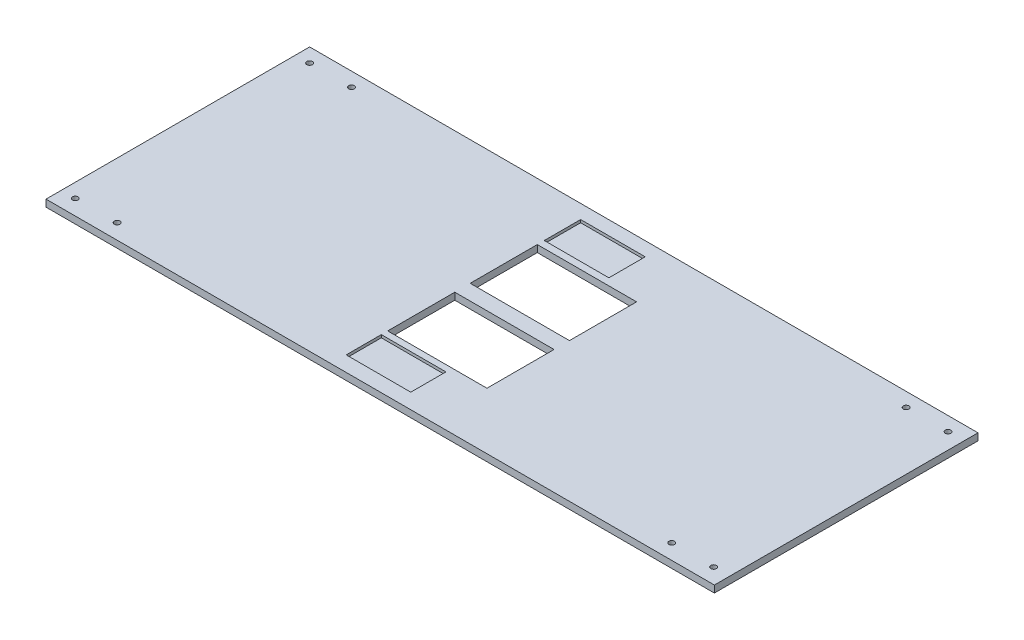
ISO-10303-21;
HEADER;
FILE_DESCRIPTION(('STEP AP214'),'2;1');
FILE_NAME('part.step','',(''),(''),'','','');
FILE_SCHEMA(('AUTOMOTIVE_DESIGN { 1 0 10303 214 1 1 1 1 }'));
ENDSEC;
DATA;
#1=APPLICATION_CONTEXT('core data for automotive mechanical design processes');
#2=APPLICATION_PROTOCOL_DEFINITION('international standard','automotive_design',2000,#1);
#3=PRODUCT_CONTEXT('',#1,'mechanical');
#4=PRODUCT('Part','Part','',(#3));
#5=PRODUCT_RELATED_PRODUCT_CATEGORY('part','',(#4));
#6=PRODUCT_DEFINITION_FORMATION('','',#4);
#7=PRODUCT_DEFINITION_CONTEXT('part definition',#1,'design');
#8=PRODUCT_DEFINITION('design','',#6,#7);
#9=PRODUCT_DEFINITION_SHAPE('','',#8);
#10=(LENGTH_UNIT() NAMED_UNIT(*) SI_UNIT(.MILLI.,.METRE.));
#11=(NAMED_UNIT(*) PLANE_ANGLE_UNIT() SI_UNIT($,.RADIAN.));
#12=(NAMED_UNIT(*) SI_UNIT($,.STERADIAN.) SOLID_ANGLE_UNIT());
#13=UNCERTAINTY_MEASURE_WITH_UNIT(LENGTH_MEASURE(1.E-05),#10,'distance_accuracy_value','');
#14=(GEOMETRIC_REPRESENTATION_CONTEXT(3) GLOBAL_UNCERTAINTY_ASSIGNED_CONTEXT((#13)) GLOBAL_UNIT_ASSIGNED_CONTEXT((#10,
#11,#12)) REPRESENTATION_CONTEXT('',''));
#15=CARTESIAN_POINT('',(0.,0.,0.));
#16=DIRECTION('',(0.,0.,1.));
#17=DIRECTION('',(1.,0.,0.));
#18=AXIS2_PLACEMENT_3D('',#15,#16,#17);
#19=CARTESIAN_POINT('',(164.635056760077,5.,0.));
#20=DIRECTION('',(1.,0.,0.));
#21=DIRECTION('',(0.,0.,-1.));
#22=AXIS2_PLACEMENT_3D('',#19,#20,#21);
#23=PLANE('',#22);
#24=DIRECTION('',(0.,-1.,0.));
#25=VECTOR('',#24,1.);
#26=CARTESIAN_POINT('',(164.635056760077,5.,-127.861939650777));
#27=LINE('',#26,#25);
#28=CARTESIAN_POINT('',(164.635056760077,5.,-127.861939650777));
#29=VERTEX_POINT('',#28);
#30=CARTESIAN_POINT('',(164.635056760077,3.,-127.861939650777));
#31=VERTEX_POINT('',#30);
#32=EDGE_CURVE('E191',#29,#31,#27,.T.);
#33=ORIENTED_EDGE('',*,*,#32,.T.);
#34=DIRECTION('',(0.,0.,1.));
#35=VECTOR('',#34,1.);
#36=CARTESIAN_POINT('',(164.635056760077,3.,-127.861939650777));
#37=LINE('',#36,#35);
#38=CARTESIAN_POINT('',(164.635056760077,3.,-101.861939650777));
#39=VERTEX_POINT('',#38);
#40=EDGE_CURVE('E51',#31,#39,#37,.T.);
#41=ORIENTED_EDGE('',*,*,#40,.T.);
#42=DIRECTION('',(0.,-1.,0.));
#43=VECTOR('',#42,1.);
#44=CARTESIAN_POINT('',(164.635056760077,5.,-101.861939650777));
#45=LINE('',#44,#43);
#46=CARTESIAN_POINT('',(164.635056760077,5.,-101.861939650777));
#47=VERTEX_POINT('',#46);
#48=EDGE_CURVE('E11',#47,#39,#45,.T.);
#49=ORIENTED_EDGE('',*,*,#48,.F.);
#50=DIRECTION('',(0.,0.,1.));
#51=VECTOR('',#50,1.);
#52=CARTESIAN_POINT('',(164.635056760077,5.,0.));
#53=LINE('',#52,#51);
#54=EDGE_CURVE('E327',#29,#47,#53,.T.);
#55=ORIENTED_EDGE('',*,*,#54,.F.);
#56=EDGE_LOOP('',(#33,#41,#49,#55));
#57=FACE_BOUND('',#56,.T.);
#58=ADVANCED_FACE('F34',(#57),#23,.F.);
#59=CARTESIAN_POINT('',(0.,5.,-101.861939650777));
#60=DIRECTION('',(0.,0.,1.));
#61=DIRECTION('',(1.,0.,0.));
#62=AXIS2_PLACEMENT_3D('',#59,#60,#61);
#63=PLANE('',#62);
#64=ORIENTED_EDGE('',*,*,#48,.T.);
#65=DIRECTION('',(-1.,0.,0.));
#66=VECTOR('',#65,1.);
#67=CARTESIAN_POINT('',(118.435056760077,3.,-101.861939650777));
#68=LINE('',#67,#66);
#69=CARTESIAN_POINT('',(118.435056760077,3.,-101.861939650777));
#70=VERTEX_POINT('',#69);
#71=EDGE_CURVE('E428',#39,#70,#68,.T.);
#72=ORIENTED_EDGE('',*,*,#71,.T.);
#73=DIRECTION('',(0.,-1.,0.));
#74=VECTOR('',#73,1.);
#75=CARTESIAN_POINT('',(118.435056760077,5.,-101.861939650777));
#76=LINE('',#75,#74);
#77=CARTESIAN_POINT('',(118.435056760077,5.,-101.861939650777));
#78=VERTEX_POINT('',#77);
#79=EDGE_CURVE('E43',#78,#70,#76,.T.);
#80=ORIENTED_EDGE('',*,*,#79,.F.);
#81=DIRECTION('',(-1.,0.,0.));
#82=VECTOR('',#81,1.);
#83=CARTESIAN_POINT('',(0.,5.,-101.861939650777));
#84=LINE('',#83,#82);
#85=EDGE_CURVE('E359',#47,#78,#84,.T.);
#86=ORIENTED_EDGE('',*,*,#85,.F.);
#87=EDGE_LOOP('',(#64,#72,#80,#86));
#88=FACE_BOUND('',#87,.T.);
#89=ADVANCED_FACE('F393',(#88),#63,.F.);
#90=CARTESIAN_POINT('',(118.435056760077,5.,0.));
#91=DIRECTION('',(1.,0.,0.));
#92=DIRECTION('',(0.,0.,-1.));
#93=AXIS2_PLACEMENT_3D('',#90,#91,#92);
#94=PLANE('',#93);
#95=DIRECTION('',(0.,0.,-1.));
#96=VECTOR('',#95,1.);
#97=CARTESIAN_POINT('',(118.435056760077,3.,-127.861939650777));
#98=LINE('',#97,#96);
#99=CARTESIAN_POINT('',(118.435056760077,3.,-127.861939650777));
#100=VERTEX_POINT('',#99);
#101=EDGE_CURVE('E173',#70,#100,#98,.T.);
#102=ORIENTED_EDGE('',*,*,#101,.T.);
#103=DIRECTION('',(0.,-1.,0.));
#104=VECTOR('',#103,1.);
#105=CARTESIAN_POINT('',(118.435056760077,5.,-127.861939650777));
#106=LINE('',#105,#104);
#107=CARTESIAN_POINT('',(118.435056760077,5.,-127.861939650777));
#108=VERTEX_POINT('',#107);
#109=EDGE_CURVE('E184',#108,#100,#106,.T.);
#110=ORIENTED_EDGE('',*,*,#109,.F.);
#111=DIRECTION('',(0.,0.,1.));
#112=VECTOR('',#111,1.);
#113=CARTESIAN_POINT('',(118.435056760077,5.,0.));
#114=LINE('',#113,#112);
#115=EDGE_CURVE('E334',#108,#78,#114,.T.);
#116=ORIENTED_EDGE('',*,*,#115,.T.);
#117=ORIENTED_EDGE('',*,*,#79,.T.);
#118=EDGE_LOOP('',(#102,#110,#116,#117));
#119=FACE_BOUND('',#118,.T.);
#120=ADVANCED_FACE('F182',(#119),#94,.T.);
#121=CARTESIAN_POINT('',(0.,5.,-96.8619396507771));
#122=DIRECTION('',(0.,0.,-1.));
#123=DIRECTION('',(-1.,0.,0.));
#124=AXIS2_PLACEMENT_3D('',#121,#122,#123);
#125=PLANE('',#124);
#126=DIRECTION('',(1.,0.,0.));
#127=VECTOR('',#126,1.);
#128=CARTESIAN_POINT('',(0.,0.,-96.8619396507771));
#129=LINE('',#128,#127);
#130=CARTESIAN_POINT('',(118.435056760077,0.,-96.8619396507771));
#131=VERTEX_POINT('',#130);
#132=CARTESIAN_POINT('',(189.435056760077,0.,-96.8619396507771));
#133=VERTEX_POINT('',#132);
#134=EDGE_CURVE('E288',#131,#133,#129,.T.);
#135=ORIENTED_EDGE('',*,*,#134,.T.);
#136=DIRECTION('',(0.,-1.,0.));
#137=VECTOR('',#136,1.);
#138=CARTESIAN_POINT('',(189.435056760077,5.,-96.8619396507771));
#139=LINE('',#138,#137);
#140=CARTESIAN_POINT('',(189.435056760077,5.,-96.8619396507771));
#141=VERTEX_POINT('',#140);
#142=EDGE_CURVE('E194',#141,#133,#139,.T.);
#143=ORIENTED_EDGE('',*,*,#142,.F.);
#144=DIRECTION('',(1.,0.,0.));
#145=VECTOR('',#144,1.);
#146=CARTESIAN_POINT('',(0.,5.,-96.8619396507771));
#147=LINE('',#146,#145);
#148=CARTESIAN_POINT('',(118.435056760077,5.,-96.8619396507771));
#149=VERTEX_POINT('',#148);
#150=EDGE_CURVE('E350',#149,#141,#147,.T.);
#151=ORIENTED_EDGE('',*,*,#150,.F.);
#152=DIRECTION('',(0.,-1.,0.));
#153=VECTOR('',#152,1.);
#154=CARTESIAN_POINT('',(118.435056760077,5.,-96.8619396507771));
#155=LINE('',#154,#153);
#156=EDGE_CURVE('E198',#149,#131,#155,.T.);
#157=ORIENTED_EDGE('',*,*,#156,.T.);
#158=EDGE_LOOP('',(#135,#143,#151,#157));
#159=FACE_BOUND('',#158,.T.);
#160=ADVANCED_FACE('F505',(#159),#125,.F.);
#161=CARTESIAN_POINT('',(189.435056760077,5.,0.));
#162=DIRECTION('',(1.,0.,0.));
#163=DIRECTION('',(0.,0.,-1.));
#164=AXIS2_PLACEMENT_3D('',#161,#162,#163);
#165=PLANE('',#164);
#166=DIRECTION('',(0.,0.,1.));
#167=VECTOR('',#166,1.);
#168=CARTESIAN_POINT('',(189.435056760077,0.,0.));
#169=LINE('',#168,#167);
#170=CARTESIAN_POINT('',(189.435056760077,0.,-48.8619396507771));
#171=VERTEX_POINT('',#170);
#172=EDGE_CURVE('E291',#133,#171,#169,.T.);
#173=ORIENTED_EDGE('',*,*,#172,.T.);
#174=DIRECTION('',(0.,-1.,0.));
#175=VECTOR('',#174,1.);
#176=CARTESIAN_POINT('',(189.435056760077,5.,-48.8619396507771));
#177=LINE('',#176,#175);
#178=CARTESIAN_POINT('',(189.435056760077,5.,-48.8619396507771));
#179=VERTEX_POINT('',#178);
#180=EDGE_CURVE('E203',#179,#171,#177,.T.);
#181=ORIENTED_EDGE('',*,*,#180,.F.);
#182=DIRECTION('',(0.,0.,1.));
#183=VECTOR('',#182,1.);
#184=CARTESIAN_POINT('',(189.435056760077,5.,0.));
#185=LINE('',#184,#183);
#186=EDGE_CURVE('E353',#141,#179,#185,.T.);
#187=ORIENTED_EDGE('',*,*,#186,.F.);
#188=ORIENTED_EDGE('',*,*,#142,.T.);
#189=EDGE_LOOP('',(#173,#181,#187,#188));
#190=FACE_BOUND('',#189,.T.);
#191=ADVANCED_FACE('F509',(#190),#165,.F.);
#192=CARTESIAN_POINT('',(0.,5.,-48.8619396507771));
#193=DIRECTION('',(0.,0.,-1.));
#194=DIRECTION('',(-1.,0.,0.));
#195=AXIS2_PLACEMENT_3D('',#192,#193,#194);
#196=PLANE('',#195);
#197=DIRECTION('',(1.,0.,0.));
#198=VECTOR('',#197,1.);
#199=CARTESIAN_POINT('',(0.,0.,-48.8619396507771));
#200=LINE('',#199,#198);
#201=CARTESIAN_POINT('',(118.435056760077,0.,-48.8619396507771));
#202=VERTEX_POINT('',#201);
#203=EDGE_CURVE('E272',#202,#171,#200,.T.);
#204=ORIENTED_EDGE('',*,*,#203,.F.);
#205=DIRECTION('',(0.,-1.,0.));
#206=VECTOR('',#205,1.);
#207=CARTESIAN_POINT('',(118.435056760077,5.,-48.8619396507771));
#208=LINE('',#207,#206);
#209=CARTESIAN_POINT('',(118.435056760077,5.,-48.8619396507771));
#210=VERTEX_POINT('',#209);
#211=EDGE_CURVE('E200',#210,#202,#208,.T.);
#212=ORIENTED_EDGE('',*,*,#211,.F.);
#213=DIRECTION('',(1.,0.,0.));
#214=VECTOR('',#213,1.);
#215=CARTESIAN_POINT('',(0.,5.,-48.8619396507771));
#216=LINE('',#215,#214);
#217=EDGE_CURVE('E355',#210,#179,#216,.T.);
#218=ORIENTED_EDGE('',*,*,#217,.T.);
#219=ORIENTED_EDGE('',*,*,#180,.T.);
#220=EDGE_LOOP('',(#204,#212,#218,#219));
#221=FACE_BOUND('',#220,.T.);
#222=ADVANCED_FACE('F466',(#221),#196,.T.);
#223=CARTESIAN_POINT('',(0.,5.,-37.8392674178881));
#224=DIRECTION('',(0.,0.,-1.));
#225=DIRECTION('',(-1.,0.,0.));
#226=AXIS2_PLACEMENT_3D('',#223,#224,#225);
#227=PLANE('',#226);
#228=DIRECTION('',(1.,0.,0.));
#229=VECTOR('',#228,1.);
#230=CARTESIAN_POINT('',(0.,0.,-37.8392674178881));
#231=LINE('',#230,#229);
#232=CARTESIAN_POINT('',(118.435056760077,0.,-37.8392674178881));
#233=VERTEX_POINT('',#232);
#234=CARTESIAN_POINT('',(189.435056760077,0.,-37.8392674178881));
#235=VERTEX_POINT('',#234);
#236=EDGE_CURVE('E279',#233,#235,#231,.T.);
#237=ORIENTED_EDGE('',*,*,#236,.T.);
#238=DIRECTION('',(0.,-1.,0.));
#239=VECTOR('',#238,1.);
#240=CARTESIAN_POINT('',(189.435056760077,5.,-37.8392674178881));
#241=LINE('',#240,#239);
#242=CARTESIAN_POINT('',(189.435056760077,5.,-37.8392674178881));
#243=VERTEX_POINT('',#242);
#244=EDGE_CURVE('E201',#243,#235,#241,.T.);
#245=ORIENTED_EDGE('',*,*,#244,.F.);
#246=DIRECTION('',(1.,0.,0.));
#247=VECTOR('',#246,1.);
#248=CARTESIAN_POINT('',(0.,5.,-37.8392674178881));
#249=LINE('',#248,#247);
#250=CARTESIAN_POINT('',(118.435056760077,5.,-37.8392674178881));
#251=VERTEX_POINT('',#250);
#252=EDGE_CURVE('E343',#251,#243,#249,.T.);
#253=ORIENTED_EDGE('',*,*,#252,.F.);
#254=DIRECTION('',(0.,-1.,0.));
#255=VECTOR('',#254,1.);
#256=CARTESIAN_POINT('',(118.435056760077,5.,-37.8392674178881));
#257=LINE('',#256,#255);
#258=EDGE_CURVE('E207',#251,#233,#257,.T.);
#259=ORIENTED_EDGE('',*,*,#258,.T.);
#260=EDGE_LOOP('',(#237,#245,#253,#259));
#261=FACE_BOUND('',#260,.T.);
#262=ADVANCED_FACE('F459',(#261),#227,.F.);
#263=CARTESIAN_POINT('',(189.435056760077,5.,-1.09539146711568E-13));
#264=DIRECTION('',(-1.,0.,0.));
#265=DIRECTION('',(0.,0.,1.));
#266=AXIS2_PLACEMENT_3D('',#263,#264,#265);
#267=PLANE('',#266);
#268=DIRECTION('',(0.,0.,-1.));
#269=VECTOR('',#268,1.);
#270=CARTESIAN_POINT('',(189.435056760077,0.,-1.09539146711568E-13));
#271=LINE('',#270,#269);
#272=CARTESIAN_POINT('',(189.435056760077,0.,10.1607325821119));
#273=VERTEX_POINT('',#272);
#274=EDGE_CURVE('E282',#273,#235,#271,.T.);
#275=ORIENTED_EDGE('',*,*,#274,.F.);
#276=DIRECTION('',(0.,-1.,0.));
#277=VECTOR('',#276,1.);
#278=CARTESIAN_POINT('',(189.435056760077,5.,10.1607325821119));
#279=LINE('',#278,#277);
#280=CARTESIAN_POINT('',(189.435056760077,5.,10.1607325821119));
#281=VERTEX_POINT('',#280);
#282=EDGE_CURVE('E212',#281,#273,#279,.T.);
#283=ORIENTED_EDGE('',*,*,#282,.F.);
#284=DIRECTION('',(0.,0.,-1.));
#285=VECTOR('',#284,1.);
#286=CARTESIAN_POINT('',(189.435056760077,5.,-1.09539146711568E-13));
#287=LINE('',#286,#285);
#288=EDGE_CURVE('E345',#281,#243,#287,.T.);
#289=ORIENTED_EDGE('',*,*,#288,.T.);
#290=ORIENTED_EDGE('',*,*,#244,.T.);
#291=EDGE_LOOP('',(#275,#283,#289,#290));
#292=FACE_BOUND('',#291,.T.);
#293=ADVANCED_FACE('F414',(#292),#267,.T.);
#294=CARTESIAN_POINT('',(0.,5.,10.1607325821119));
#295=DIRECTION('',(0.,0.,1.));
#296=DIRECTION('',(1.,0.,0.));
#297=AXIS2_PLACEMENT_3D('',#294,#295,#296);
#298=PLANE('',#297);
#299=DIRECTION('',(-1.,0.,0.));
#300=VECTOR('',#299,1.);
#301=CARTESIAN_POINT('',(0.,0.,10.1607325821119));
#302=LINE('',#301,#300);
#303=CARTESIAN_POINT('',(118.435056760077,0.,10.1607325821119));
#304=VERTEX_POINT('',#303);
#305=EDGE_CURVE('E285',#273,#304,#302,.T.);
#306=ORIENTED_EDGE('',*,*,#305,.T.);
#307=DIRECTION('',(0.,-1.,0.));
#308=VECTOR('',#307,1.);
#309=CARTESIAN_POINT('',(118.435056760077,5.,10.1607325821119));
#310=LINE('',#309,#308);
#311=CARTESIAN_POINT('',(118.435056760077,5.,10.1607325821119));
#312=VERTEX_POINT('',#311);
#313=EDGE_CURVE('E209',#312,#304,#310,.T.);
#314=ORIENTED_EDGE('',*,*,#313,.F.);
#315=DIRECTION('',(-1.,0.,0.));
#316=VECTOR('',#315,1.);
#317=CARTESIAN_POINT('',(0.,5.,10.1607325821119));
#318=LINE('',#317,#316);
#319=EDGE_CURVE('E348',#281,#312,#318,.T.);
#320=ORIENTED_EDGE('',*,*,#319,.F.);
#321=ORIENTED_EDGE('',*,*,#282,.T.);
#322=EDGE_LOOP('',(#306,#314,#320,#321));
#323=FACE_BOUND('',#322,.T.);
#324=ADVANCED_FACE('F405',(#323),#298,.F.);
#325=DIRECTION('',(0.,-1.,0.));
#326=VECTOR('',#325,1.);
#327=CARTESIAN_POINT('',(164.635056760077,5.,14.7280603492229));
#328=LINE('',#327,#326);
#329=CARTESIAN_POINT('',(164.635056760077,5.,14.7280603492229));
#330=VERTEX_POINT('',#329);
#331=CARTESIAN_POINT('',(164.635056760077,3.,14.7280603492229));
#332=VERTEX_POINT('',#331);
#333=EDGE_CURVE('E215',#330,#332,#328,.T.);
#334=ORIENTED_EDGE('',*,*,#333,.T.);
#335=DIRECTION('',(0.,0.,1.));
#336=VECTOR('',#335,1.);
#337=CARTESIAN_POINT('',(164.635056760077,3.,14.7280603492229));
#338=LINE('',#337,#336);
#339=CARTESIAN_POINT('',(164.635056760077,3.,39.8415615787334));
#340=VERTEX_POINT('',#339);
#341=EDGE_CURVE('E59',#332,#340,#338,.T.);
#342=ORIENTED_EDGE('',*,*,#341,.T.);
#343=DIRECTION('',(0.,-1.,0.));
#344=VECTOR('',#343,1.);
#345=CARTESIAN_POINT('',(164.635056760077,5.,39.8415615787334));
#346=LINE('',#345,#344);
#347=CARTESIAN_POINT('',(164.635056760077,5.,39.8415615787334));
#348=VERTEX_POINT('',#347);
#349=EDGE_CURVE('E210',#348,#340,#346,.T.);
#350=ORIENTED_EDGE('',*,*,#349,.F.);
#351=EDGE_CURVE('E324',#330,#348,#53,.T.);
#352=ORIENTED_EDGE('',*,*,#351,.F.);
#353=EDGE_LOOP('',(#334,#342,#350,#352));
#354=FACE_BOUND('',#353,.T.);
#355=ADVANCED_FACE('F396',(#354),#23,.F.);
#356=CARTESIAN_POINT('',(0.,5.,39.8415615787334));
#357=DIRECTION('',(0.,0.,-1.));
#358=DIRECTION('',(-1.,0.,0.));
#359=AXIS2_PLACEMENT_3D('',#356,#357,#358);
#360=PLANE('',#359);
#361=DIRECTION('',(-1.,0.,0.));
#362=VECTOR('',#361,1.);
#363=CARTESIAN_POINT('',(118.435056760077,3.,39.8415615787334));
#364=LINE('',#363,#362);
#365=CARTESIAN_POINT('',(118.435056760077,3.,39.8415615787334));
#366=VERTEX_POINT('',#365);
#367=EDGE_CURVE('E253',#340,#366,#364,.T.);
#368=ORIENTED_EDGE('',*,*,#367,.T.);
#369=DIRECTION('',(0.,-1.,0.));
#370=VECTOR('',#369,1.);
#371=CARTESIAN_POINT('',(118.435056760077,5.,39.8415615787334));
#372=LINE('',#371,#370);
#373=CARTESIAN_POINT('',(118.435056760077,5.,39.8415615787334));
#374=VERTEX_POINT('',#373);
#375=EDGE_CURVE('E221',#374,#366,#372,.T.);
#376=ORIENTED_EDGE('',*,*,#375,.F.);
#377=DIRECTION('',(1.,0.,0.));
#378=VECTOR('',#377,1.);
#379=CARTESIAN_POINT('',(0.,5.,39.8415615787334));
#380=LINE('',#379,#378);
#381=EDGE_CURVE('E326',#374,#348,#380,.T.);
#382=ORIENTED_EDGE('',*,*,#381,.T.);
#383=ORIENTED_EDGE('',*,*,#349,.T.);
#384=EDGE_LOOP('',(#368,#376,#382,#383));
#385=FACE_BOUND('',#384,.T.);
#386=ADVANCED_FACE('F404',(#385),#360,.T.);
#387=DIRECTION('',(0.,0.,-1.));
#388=VECTOR('',#387,1.);
#389=CARTESIAN_POINT('',(118.435056760077,3.,14.7280603492229));
#390=LINE('',#389,#388);
#391=CARTESIAN_POINT('',(118.435056760077,3.,14.7280603492229));
#392=VERTEX_POINT('',#391);
#393=EDGE_CURVE('E426',#366,#392,#390,.T.);
#394=ORIENTED_EDGE('',*,*,#393,.T.);
#395=DIRECTION('',(0.,-1.,0.));
#396=VECTOR('',#395,1.);
#397=CARTESIAN_POINT('',(118.435056760077,5.,14.7280603492229));
#398=LINE('',#397,#396);
#399=CARTESIAN_POINT('',(118.435056760077,5.,14.7280603492229));
#400=VERTEX_POINT('',#399);
#401=EDGE_CURVE('E218',#400,#392,#398,.T.);
#402=ORIENTED_EDGE('',*,*,#401,.F.);
#403=EDGE_CURVE('E330',#400,#374,#114,.T.);
#404=ORIENTED_EDGE('',*,*,#403,.T.);
#405=ORIENTED_EDGE('',*,*,#375,.T.);
#406=EDGE_LOOP('',(#394,#402,#404,#405));
#407=FACE_BOUND('',#406,.T.);
#408=ADVANCED_FACE('F411',(#407),#94,.T.);
#409=CARTESIAN_POINT('',(0.,5.,50.7280603492229));
#410=DIRECTION('',(0.,0.,-1.));
#411=DIRECTION('',(-1.,0.,0.));
#412=AXIS2_PLACEMENT_3D('',#409,#410,#411);
#413=PLANE('',#412);
#414=DIRECTION('',(1.,0.,0.));
#415=VECTOR('',#414,1.);
#416=CARTESIAN_POINT('',(0.,0.,50.7280603492229));
#417=LINE('',#416,#415);
#418=CARTESIAN_POINT('',(-85.4449432399227,0.,50.7280603492229));
#419=VERTEX_POINT('',#418);
#420=CARTESIAN_POINT('',(392.705056760077,0.,50.7280603492229));
#421=VERTEX_POINT('',#420);
#422=EDGE_CURVE('E249',#419,#421,#417,.T.);
#423=ORIENTED_EDGE('',*,*,#422,.T.);
#424=DIRECTION('',(0.,-1.,0.));
#425=VECTOR('',#424,1.);
#426=CARTESIAN_POINT('',(392.705056760077,5.,50.7280603492229));
#427=LINE('',#426,#425);
#428=CARTESIAN_POINT('',(392.705056760077,5.,50.7280603492229));
#429=VERTEX_POINT('',#428);
#430=EDGE_CURVE('E38',#429,#421,#427,.T.);
#431=ORIENTED_EDGE('',*,*,#430,.F.);
#432=DIRECTION('',(1.,0.,0.));
#433=VECTOR('',#432,1.);
#434=CARTESIAN_POINT('',(0.,5.,50.7280603492229));
#435=LINE('',#434,#433);
#436=CARTESIAN_POINT('',(-85.4449432399227,5.,50.7280603492229));
#437=VERTEX_POINT('',#436);
#438=EDGE_CURVE('E308',#437,#429,#435,.T.);
#439=ORIENTED_EDGE('',*,*,#438,.F.);
#440=DIRECTION('',(0.,-1.,0.));
#441=VECTOR('',#440,1.);
#442=CARTESIAN_POINT('',(-85.4449432399227,5.,50.7280603492229));
#443=LINE('',#442,#441);
#444=EDGE_CURVE('E226',#437,#419,#443,.T.);
#445=ORIENTED_EDGE('',*,*,#444,.T.);
#446=EDGE_LOOP('',(#423,#431,#439,#445));
#447=FACE_BOUND('',#446,.T.);
#448=ADVANCED_FACE('F36',(#447),#413,.F.);
#449=CARTESIAN_POINT('',(392.705056760077,5.,0.));
#450=DIRECTION('',(1.,0.,0.));
#451=DIRECTION('',(0.,0.,-1.));
#452=AXIS2_PLACEMENT_3D('',#449,#450,#451);
#453=PLANE('',#452);
#454=DIRECTION('',(0.,0.,1.));
#455=VECTOR('',#454,1.);
#456=CARTESIAN_POINT('',(392.705056760077,0.,0.));
#457=LINE('',#456,#455);
#458=CARTESIAN_POINT('',(392.705056760077,0.,-137.861939650777));
#459=VERTEX_POINT('',#458);
#460=EDGE_CURVE('E242',#459,#421,#457,.T.);
#461=ORIENTED_EDGE('',*,*,#460,.F.);
#462=DIRECTION('',(0.,-1.,0.));
#463=VECTOR('',#462,1.);
#464=CARTESIAN_POINT('',(392.705056760077,5.,-137.861939650777));
#465=LINE('',#464,#463);
#466=CARTESIAN_POINT('',(392.705056760077,5.,-137.861939650777));
#467=VERTEX_POINT('',#466);
#468=EDGE_CURVE('E231',#467,#459,#465,.T.);
#469=ORIENTED_EDGE('',*,*,#468,.F.);
#470=DIRECTION('',(0.,0.,1.));
#471=VECTOR('',#470,1.);
#472=CARTESIAN_POINT('',(392.705056760077,5.,0.));
#473=LINE('',#472,#471);
#474=EDGE_CURVE('E245',#467,#429,#473,.T.);
#475=ORIENTED_EDGE('',*,*,#474,.T.);
#476=ORIENTED_EDGE('',*,*,#430,.T.);
#477=EDGE_LOOP('',(#461,#469,#475,#476));
#478=FACE_BOUND('',#477,.T.);
#479=ADVANCED_FACE('F240',(#478),#453,.T.);
#480=CARTESIAN_POINT('',(0.,5.,-137.861939650777));
#481=DIRECTION('',(0.,0.,-1.));
#482=DIRECTION('',(-1.,0.,0.));
#483=AXIS2_PLACEMENT_3D('',#480,#481,#482);
#484=PLANE('',#483);
#485=DIRECTION('',(1.,0.,0.));
#486=VECTOR('',#485,1.);
#487=CARTESIAN_POINT('',(0.,0.,-137.861939650777));
#488=LINE('',#487,#486);
#489=CARTESIAN_POINT('',(-85.4449432399227,0.,-137.861939650777));
#490=VERTEX_POINT('',#489);
#491=EDGE_CURVE('E257',#490,#459,#488,.T.);
#492=ORIENTED_EDGE('',*,*,#491,.F.);
#493=DIRECTION('',(0.,-1.,0.));
#494=VECTOR('',#493,1.);
#495=CARTESIAN_POINT('',(-85.4449432399227,5.,-137.861939650777));
#496=LINE('',#495,#494);
#497=CARTESIAN_POINT('',(-85.4449432399227,5.,-137.861939650777));
#498=VERTEX_POINT('',#497);
#499=EDGE_CURVE('E229',#498,#490,#496,.T.);
#500=ORIENTED_EDGE('',*,*,#499,.F.);
#501=DIRECTION('',(1.,0.,0.));
#502=VECTOR('',#501,1.);
#503=CARTESIAN_POINT('',(0.,5.,-137.861939650777));
#504=LINE('',#503,#502);
#505=EDGE_CURVE('E313',#498,#467,#504,.T.);
#506=ORIENTED_EDGE('',*,*,#505,.T.);
#507=ORIENTED_EDGE('',*,*,#468,.T.);
#508=EDGE_LOOP('',(#492,#500,#506,#507));
#509=FACE_BOUND('',#508,.T.);
#510=ADVANCED_FACE('F487',(#509),#484,.T.);
#511=CARTESIAN_POINT('',(-45.4449432399227,5.,-127.861939650777));
#512=DIRECTION('',(0.,-1.,0.));
#513=DIRECTION('',(0.,0.,-1.));
#514=AXIS2_PLACEMENT_3D('',#511,#512,#513);
#515=CYLINDRICAL_SURFACE('',#514,2.);
#516=CARTESIAN_POINT('',(-45.4449432399227,5.,-127.861939650777));
#517=DIRECTION('',(0.,1.,0.));
#518=DIRECTION('',(0.,0.,1.));
#519=AXIS2_PLACEMENT_3D('',#516,#517,#518);
#520=CIRCLE('',#519,2.);
#521=CARTESIAN_POINT('',(-45.4449432399227,5.,-125.861939650777));
#522=VERTEX_POINT('',#521);
#523=EDGE_CURVE('E371',#522,#522,#520,.T.);
#524=ORIENTED_EDGE('',*,*,#523,.T.);
#525=EDGE_LOOP('',(#524));
#526=FACE_BOUND('',#525,.T.);
#527=CARTESIAN_POINT('',(-45.4449432399227,0.,-127.861939650777));
#528=DIRECTION('',(0.,1.,0.));
#529=DIRECTION('',(0.,0.,1.));
#530=AXIS2_PLACEMENT_3D('',#527,#528,#529);
#531=CIRCLE('',#530,2.);
#532=CARTESIAN_POINT('',(-45.4449432399227,0.,-125.861939650777));
#533=VERTEX_POINT('',#532);
#534=EDGE_CURVE('E304',#533,#533,#531,.T.);
#535=ORIENTED_EDGE('',*,*,#534,.F.);
#536=EDGE_LOOP('',(#535));
#537=FACE_BOUND('',#536,.T.);
#538=ADVANCED_FACE('F489',(#526,#537),#515,.F.);
#539=CARTESIAN_POINT('',(-75.4449432399227,5.,39.8415615787334));
#540=DIRECTION('',(0.,-1.,0.));
#541=DIRECTION('',(0.,0.,-1.));
#542=AXIS2_PLACEMENT_3D('',#539,#540,#541);
#543=CYLINDRICAL_SURFACE('',#542,2.);
#544=CARTESIAN_POINT('',(-75.4449432399227,5.,39.8415615787334));
#545=DIRECTION('',(0.,1.,0.));
#546=DIRECTION('',(0.,0.,1.));
#547=AXIS2_PLACEMENT_3D('',#544,#545,#546);
#548=CIRCLE('',#547,2.);
#549=CARTESIAN_POINT('',(-75.4449432399227,5.,41.8415615787334));
#550=VERTEX_POINT('',#549);
#551=EDGE_CURVE('E368',#550,#550,#548,.T.);
#552=ORIENTED_EDGE('',*,*,#551,.T.);
#553=EDGE_LOOP('',(#552));
#554=FACE_BOUND('',#553,.T.);
#555=CARTESIAN_POINT('',(-75.4449432399227,0.,39.8415615787334));
#556=DIRECTION('',(0.,1.,0.));
#557=DIRECTION('',(0.,0.,1.));
#558=AXIS2_PLACEMENT_3D('',#555,#556,#557);
#559=CIRCLE('',#558,2.);
#560=CARTESIAN_POINT('',(-75.4449432399227,0.,41.8415615787334));
#561=VERTEX_POINT('',#560);
#562=EDGE_CURVE('E301',#561,#561,#559,.T.);
#563=ORIENTED_EDGE('',*,*,#562,.F.);
#564=EDGE_LOOP('',(#563));
#565=FACE_BOUND('',#564,.T.);
#566=ADVANCED_FACE('F577',(#554,#565),#543,.F.);
#567=CARTESIAN_POINT('',(-45.4449432399227,5.,39.8415615787334));
#568=DIRECTION('',(0.,-1.,0.));
#569=DIRECTION('',(0.,0.,-1.));
#570=AXIS2_PLACEMENT_3D('',#567,#568,#569);
#571=CYLINDRICAL_SURFACE('',#570,2.);
#572=CARTESIAN_POINT('',(-45.4449432399227,5.,39.8415615787334));
#573=DIRECTION('',(0.,1.,0.));
#574=DIRECTION('',(0.,0.,1.));
#575=AXIS2_PLACEMENT_3D('',#572,#573,#574);
#576=CIRCLE('',#575,2.);
#577=CARTESIAN_POINT('',(-45.4449432399227,5.,41.8415615787334));
#578=VERTEX_POINT('',#577);
#579=EDGE_CURVE('E365',#578,#578,#576,.T.);
#580=ORIENTED_EDGE('',*,*,#579,.T.);
#581=EDGE_LOOP('',(#580));
#582=FACE_BOUND('',#581,.T.);
#583=CARTESIAN_POINT('',(-45.4449432399227,0.,39.8415615787334));
#584=DIRECTION('',(0.,1.,0.));
#585=DIRECTION('',(0.,0.,1.));
#586=AXIS2_PLACEMENT_3D('',#583,#584,#585);
#587=CIRCLE('',#586,2.);
#588=CARTESIAN_POINT('',(-45.4449432399227,0.,41.8415615787334));
#589=VERTEX_POINT('',#588);
#590=EDGE_CURVE('E298',#589,#589,#587,.T.);
#591=ORIENTED_EDGE('',*,*,#590,.F.);
#592=EDGE_LOOP('',(#591));
#593=FACE_BOUND('',#592,.T.);
#594=ADVANCED_FACE('F587',(#582,#593),#571,.F.);
#595=CARTESIAN_POINT('',(351.300456076252,5.,-127.861939650777));
#596=DIRECTION('',(0.,-1.,0.));
#597=DIRECTION('',(0.,0.,-1.));
#598=AXIS2_PLACEMENT_3D('',#595,#596,#597);
#599=CYLINDRICAL_SURFACE('',#598,2.);
#600=CARTESIAN_POINT('',(351.300456076252,5.,-127.861939650777));
#601=DIRECTION('',(0.,1.,0.));
#602=DIRECTION('',(0.,0.,1.));
#603=AXIS2_PLACEMENT_3D('',#600,#601,#602);
#604=CIRCLE('',#603,2.);
#605=CARTESIAN_POINT('',(351.300456076252,5.,-125.861939650777));
#606=VERTEX_POINT('',#605);
#607=EDGE_CURVE('E362',#606,#606,#604,.T.);
#608=ORIENTED_EDGE('',*,*,#607,.T.);
#609=EDGE_LOOP('',(#608));
#610=FACE_BOUND('',#609,.T.);
#611=CARTESIAN_POINT('',(351.300456076252,0.,-127.861939650777));
#612=DIRECTION('',(0.,1.,0.));
#613=DIRECTION('',(0.,0.,1.));
#614=AXIS2_PLACEMENT_3D('',#611,#612,#613);
#615=CIRCLE('',#614,2.);
#616=CARTESIAN_POINT('',(351.300456076252,0.,-125.861939650777));
#617=VERTEX_POINT('',#616);
#618=EDGE_CURVE('E271',#617,#617,#615,.T.);
#619=ORIENTED_EDGE('',*,*,#618,.F.);
#620=EDGE_LOOP('',(#619));
#621=FACE_BOUND('',#620,.T.);
#622=ADVANCED_FACE('F515',(#610,#621),#599,.F.);
#623=CARTESIAN_POINT('',(0.,5.,-127.861939650777));
#624=DIRECTION('',(0.,0.,-1.));
#625=DIRECTION('',(-1.,0.,0.));
#626=AXIS2_PLACEMENT_3D('',#623,#624,#625);
#627=PLANE('',#626);
#628=ORIENTED_EDGE('',*,*,#109,.T.);
#629=DIRECTION('',(1.,0.,0.));
#630=VECTOR('',#629,1.);
#631=CARTESIAN_POINT('',(118.435056760077,3.,-127.861939650777));
#632=LINE('',#631,#630);
#633=EDGE_CURVE('E170',#100,#31,#632,.T.);
#634=ORIENTED_EDGE('',*,*,#633,.T.);
#635=ORIENTED_EDGE('',*,*,#32,.F.);
#636=DIRECTION('',(1.,0.,0.));
#637=VECTOR('',#636,1.);
#638=CARTESIAN_POINT('',(0.,5.,-127.861939650777));
#639=LINE('',#638,#637);
#640=EDGE_CURVE('E189',#108,#29,#639,.T.);
#641=ORIENTED_EDGE('',*,*,#640,.F.);
#642=EDGE_LOOP('',(#628,#634,#635,#641));
#643=FACE_BOUND('',#642,.T.);
#644=ADVANCED_FACE('F188',(#643),#627,.F.);
#645=DIRECTION('',(0.,0.,1.));
#646=VECTOR('',#645,1.);
#647=CARTESIAN_POINT('',(118.435056760077,0.,0.));
#648=LINE('',#647,#646);
#649=EDGE_CURVE('E268',#131,#202,#648,.T.);
#650=ORIENTED_EDGE('',*,*,#649,.F.);
#651=ORIENTED_EDGE('',*,*,#156,.F.);
#652=EDGE_CURVE('E358',#149,#210,#114,.T.);
#653=ORIENTED_EDGE('',*,*,#652,.T.);
#654=ORIENTED_EDGE('',*,*,#211,.T.);
#655=EDGE_LOOP('',(#650,#651,#653,#654));
#656=FACE_BOUND('',#655,.T.);
#657=ADVANCED_FACE('F503',(#656),#94,.T.);
#658=EDGE_CURVE('E273',#233,#304,#648,.T.);
#659=ORIENTED_EDGE('',*,*,#658,.F.);
#660=ORIENTED_EDGE('',*,*,#258,.F.);
#661=EDGE_CURVE('E335',#251,#312,#114,.T.);
#662=ORIENTED_EDGE('',*,*,#661,.T.);
#663=ORIENTED_EDGE('',*,*,#313,.T.);
#664=EDGE_LOOP('',(#659,#660,#662,#663));
#665=FACE_BOUND('',#664,.T.);
#666=ADVANCED_FACE('F444',(#665),#94,.T.);
#667=CARTESIAN_POINT('',(351.300456076252,5.,39.8415615787334));
#668=DIRECTION('',(0.,-1.,0.));
#669=DIRECTION('',(0.,0.,-1.));
#670=AXIS2_PLACEMENT_3D('',#667,#668,#669);
#671=CYLINDRICAL_SURFACE('',#670,2.);
#672=CARTESIAN_POINT('',(351.300456076252,5.,39.8415615787334));
#673=DIRECTION('',(0.,1.,0.));
#674=DIRECTION('',(0.,0.,1.));
#675=AXIS2_PLACEMENT_3D('',#672,#673,#674);
#676=CIRCLE('',#675,2.);
#677=CARTESIAN_POINT('',(351.300456076252,5.,41.8415615787334));
#678=VERTEX_POINT('',#677);
#679=EDGE_CURVE('E340',#678,#678,#676,.T.);
#680=ORIENTED_EDGE('',*,*,#679,.T.);
#681=EDGE_LOOP('',(#680));
#682=FACE_BOUND('',#681,.T.);
#683=CARTESIAN_POINT('',(351.300456076252,0.,39.8415615787334));
#684=DIRECTION('',(0.,1.,0.));
#685=DIRECTION('',(0.,0.,1.));
#686=AXIS2_PLACEMENT_3D('',#683,#684,#685);
#687=CIRCLE('',#686,2.);
#688=CARTESIAN_POINT('',(351.300456076252,0.,41.8415615787334));
#689=VERTEX_POINT('',#688);
#690=EDGE_CURVE('E276',#689,#689,#687,.T.);
#691=ORIENTED_EDGE('',*,*,#690,.F.);
#692=EDGE_LOOP('',(#691));
#693=FACE_BOUND('',#692,.T.);
#694=ADVANCED_FACE('F470',(#682,#693),#671,.F.);
#695=CARTESIAN_POINT('',(381.300456076252,5.,-127.861939650777));
#696=DIRECTION('',(0.,-1.,0.));
#697=DIRECTION('',(0.,0.,-1.));
#698=AXIS2_PLACEMENT_3D('',#695,#696,#697);
#699=CYLINDRICAL_SURFACE('',#698,2.);
#700=CARTESIAN_POINT('',(381.300456076252,5.,-127.861939650777));
#701=DIRECTION('',(0.,1.,0.));
#702=DIRECTION('',(0.,0.,1.));
#703=AXIS2_PLACEMENT_3D('',#700,#701,#702);
#704=CIRCLE('',#703,2.);
#705=CARTESIAN_POINT('',(381.300456076252,5.,-125.861939650777));
#706=VERTEX_POINT('',#705);
#707=EDGE_CURVE('E337',#706,#706,#704,.T.);
#708=ORIENTED_EDGE('',*,*,#707,.T.);
#709=EDGE_LOOP('',(#708));
#710=FACE_BOUND('',#709,.T.);
#711=CARTESIAN_POINT('',(381.300456076252,0.,-127.861939650777));
#712=DIRECTION('',(0.,1.,0.));
#713=DIRECTION('',(0.,0.,1.));
#714=AXIS2_PLACEMENT_3D('',#711,#712,#713);
#715=CIRCLE('',#714,2.);
#716=CARTESIAN_POINT('',(381.300456076252,0.,-125.861939650777));
#717=VERTEX_POINT('',#716);
#718=EDGE_CURVE('E267',#717,#717,#715,.T.);
#719=ORIENTED_EDGE('',*,*,#718,.F.);
#720=EDGE_LOOP('',(#719));
#721=FACE_BOUND('',#720,.T.);
#722=ADVANCED_FACE('F473',(#710,#721),#699,.F.);
#723=CARTESIAN_POINT('',(0.,5.,14.7280603492229));
#724=DIRECTION('',(0.,0.,-1.));
#725=DIRECTION('',(-1.,0.,0.));
#726=AXIS2_PLACEMENT_3D('',#723,#724,#725);
#727=PLANE('',#726);
#728=ORIENTED_EDGE('',*,*,#401,.T.);
#729=DIRECTION('',(1.,0.,0.));
#730=VECTOR('',#729,1.);
#731=CARTESIAN_POINT('',(118.435056760077,3.,14.7280603492229));
#732=LINE('',#731,#730);
#733=EDGE_CURVE('E424',#392,#332,#732,.T.);
#734=ORIENTED_EDGE('',*,*,#733,.T.);
#735=ORIENTED_EDGE('',*,*,#333,.F.);
#736=DIRECTION('',(1.,0.,0.));
#737=VECTOR('',#736,1.);
#738=CARTESIAN_POINT('',(0.,5.,14.7280603492229));
#739=LINE('',#738,#737);
#740=EDGE_CURVE('E333',#400,#330,#739,.T.);
#741=ORIENTED_EDGE('',*,*,#740,.F.);
#742=EDGE_LOOP('',(#728,#734,#735,#741));
#743=FACE_BOUND('',#742,.T.);
#744=ADVANCED_FACE('F422',(#743),#727,.F.);
#745=CARTESIAN_POINT('',(381.300456076252,5.,39.8415615787334));
#746=DIRECTION('',(0.,-1.,0.));
#747=DIRECTION('',(0.,0.,-1.));
#748=AXIS2_PLACEMENT_3D('',#745,#746,#747);
#749=CYLINDRICAL_SURFACE('',#748,2.);
#750=CARTESIAN_POINT('',(381.300456076252,5.,39.8415615787334));
#751=DIRECTION('',(0.,1.,0.));
#752=DIRECTION('',(0.,0.,1.));
#753=AXIS2_PLACEMENT_3D('',#750,#751,#752);
#754=CIRCLE('',#753,2.);
#755=CARTESIAN_POINT('',(381.300456076252,5.,41.8415615787334));
#756=VERTEX_POINT('',#755);
#757=EDGE_CURVE('E321',#756,#756,#754,.T.);
#758=ORIENTED_EDGE('',*,*,#757,.T.);
#759=EDGE_LOOP('',(#758));
#760=FACE_BOUND('',#759,.T.);
#761=CARTESIAN_POINT('',(381.300456076252,0.,39.8415615787334));
#762=DIRECTION('',(0.,1.,0.));
#763=DIRECTION('',(0.,0.,1.));
#764=AXIS2_PLACEMENT_3D('',#761,#762,#763);
#765=CIRCLE('',#764,2.);
#766=CARTESIAN_POINT('',(381.300456076252,0.,41.8415615787334));
#767=VERTEX_POINT('',#766);
#768=EDGE_CURVE('E264',#767,#767,#765,.T.);
#769=ORIENTED_EDGE('',*,*,#768,.F.);
#770=EDGE_LOOP('',(#769));
#771=FACE_BOUND('',#770,.T.);
#772=ADVANCED_FACE('F479',(#760,#771),#749,.F.);
#773=CARTESIAN_POINT('',(-85.4449432399227,5.,0.));
#774=DIRECTION('',(1.,0.,0.));
#775=DIRECTION('',(0.,0.,-1.));
#776=AXIS2_PLACEMENT_3D('',#773,#774,#775);
#777=PLANE('',#776);
#778=DIRECTION('',(0.,0.,1.));
#779=VECTOR('',#778,1.);
#780=CARTESIAN_POINT('',(-85.4449432399227,0.,0.));
#781=LINE('',#780,#779);
#782=EDGE_CURVE('E259',#490,#419,#781,.T.);
#783=ORIENTED_EDGE('',*,*,#782,.T.);
#784=ORIENTED_EDGE('',*,*,#444,.F.);
#785=DIRECTION('',(0.,0.,1.));
#786=VECTOR('',#785,1.);
#787=CARTESIAN_POINT('',(-85.4449432399227,5.,0.));
#788=LINE('',#787,#786);
#789=EDGE_CURVE('E319',#498,#437,#788,.T.);
#790=ORIENTED_EDGE('',*,*,#789,.F.);
#791=ORIENTED_EDGE('',*,*,#499,.T.);
#792=EDGE_LOOP('',(#783,#784,#790,#791));
#793=FACE_BOUND('',#792,.T.);
#794=ADVANCED_FACE('F388',(#793),#777,.F.);
#795=CARTESIAN_POINT('',(-75.4449432399227,5.,-127.861939650777));
#796=DIRECTION('',(0.,-1.,0.));
#797=DIRECTION('',(0.,0.,-1.));
#798=AXIS2_PLACEMENT_3D('',#795,#796,#797);
#799=CYLINDRICAL_SURFACE('',#798,2.);
#800=CARTESIAN_POINT('',(-75.4449432399227,5.,-127.861939650777));
#801=DIRECTION('',(0.,1.,0.));
#802=DIRECTION('',(0.,0.,1.));
#803=AXIS2_PLACEMENT_3D('',#800,#801,#802);
#804=CIRCLE('',#803,2.);
#805=CARTESIAN_POINT('',(-75.4449432399227,5.,-125.861939650777));
#806=VERTEX_POINT('',#805);
#807=EDGE_CURVE('E230',#806,#806,#804,.T.);
#808=ORIENTED_EDGE('',*,*,#807,.T.);
#809=EDGE_LOOP('',(#808));
#810=FACE_BOUND('',#809,.T.);
#811=CARTESIAN_POINT('',(-75.4449432399227,0.,-127.861939650777));
#812=DIRECTION('',(0.,1.,0.));
#813=DIRECTION('',(0.,0.,1.));
#814=AXIS2_PLACEMENT_3D('',#811,#812,#813);
#815=CIRCLE('',#814,2.);
#816=CARTESIAN_POINT('',(-75.4449432399227,0.,-125.861939650777));
#817=VERTEX_POINT('',#816);
#818=EDGE_CURVE('E306',#817,#817,#815,.T.);
#819=ORIENTED_EDGE('',*,*,#818,.F.);
#820=EDGE_LOOP('',(#819));
#821=FACE_BOUND('',#820,.T.);
#822=ADVANCED_FACE('F376',(#810,#821),#799,.F.);
#823=CARTESIAN_POINT('',(0.,5.,0.));
#824=DIRECTION('',(0.,1.,0.));
#825=DIRECTION('',(0.,0.,1.));
#826=AXIS2_PLACEMENT_3D('',#823,#824,#825);
#827=PLANE('',#826);
#828=ORIENTED_EDGE('',*,*,#438,.T.);
#829=ORIENTED_EDGE('',*,*,#474,.F.);
#830=ORIENTED_EDGE('',*,*,#505,.F.);
#831=ORIENTED_EDGE('',*,*,#789,.T.);
#832=EDGE_LOOP('',(#828,#829,#830,#831));
#833=FACE_BOUND('',#832,.T.);
#834=ORIENTED_EDGE('',*,*,#757,.F.);
#835=EDGE_LOOP('',(#834));
#836=FACE_BOUND('',#835,.T.);
#837=ORIENTED_EDGE('',*,*,#351,.T.);
#838=ORIENTED_EDGE('',*,*,#381,.F.);
#839=ORIENTED_EDGE('',*,*,#403,.F.);
#840=ORIENTED_EDGE('',*,*,#740,.T.);
#841=EDGE_LOOP('',(#837,#838,#839,#840));
#842=FACE_BOUND('',#841,.T.);
#843=ORIENTED_EDGE('',*,*,#707,.F.);
#844=EDGE_LOOP('',(#843));
#845=FACE_BOUND('',#844,.T.);
#846=ORIENTED_EDGE('',*,*,#679,.F.);
#847=EDGE_LOOP('',(#846));
#848=FACE_BOUND('',#847,.T.);
#849=ORIENTED_EDGE('',*,*,#252,.T.);
#850=ORIENTED_EDGE('',*,*,#288,.F.);
#851=ORIENTED_EDGE('',*,*,#319,.T.);
#852=ORIENTED_EDGE('',*,*,#661,.F.);
#853=EDGE_LOOP('',(#849,#850,#851,#852));
#854=FACE_BOUND('',#853,.T.);
#855=ORIENTED_EDGE('',*,*,#150,.T.);
#856=ORIENTED_EDGE('',*,*,#186,.T.);
#857=ORIENTED_EDGE('',*,*,#217,.F.);
#858=ORIENTED_EDGE('',*,*,#652,.F.);
#859=EDGE_LOOP('',(#855,#856,#857,#858));
#860=FACE_BOUND('',#859,.T.);
#861=ORIENTED_EDGE('',*,*,#54,.T.);
#862=ORIENTED_EDGE('',*,*,#85,.T.);
#863=ORIENTED_EDGE('',*,*,#115,.F.);
#864=ORIENTED_EDGE('',*,*,#640,.T.);
#865=EDGE_LOOP('',(#861,#862,#863,#864));
#866=FACE_BOUND('',#865,.T.);
#867=ORIENTED_EDGE('',*,*,#607,.F.);
#868=EDGE_LOOP('',(#867));
#869=FACE_BOUND('',#868,.T.);
#870=ORIENTED_EDGE('',*,*,#579,.F.);
#871=EDGE_LOOP('',(#870));
#872=FACE_BOUND('',#871,.T.);
#873=ORIENTED_EDGE('',*,*,#551,.F.);
#874=EDGE_LOOP('',(#873));
#875=FACE_BOUND('',#874,.T.);
#876=ORIENTED_EDGE('',*,*,#523,.F.);
#877=EDGE_LOOP('',(#876));
#878=FACE_BOUND('',#877,.T.);
#879=ORIENTED_EDGE('',*,*,#807,.F.);
#880=EDGE_LOOP('',(#879));
#881=FACE_BOUND('',#880,.T.);
#882=ADVANCED_FACE('F379',(#833,#836,#842,#845,#848,#854,#860,#866,#869,#872,#875,#878,#881),
#827,.T.);
#883=CARTESIAN_POINT('',(0.,0.,0.));
#884=DIRECTION('',(0.,1.,0.));
#885=DIRECTION('',(0.,0.,1.));
#886=AXIS2_PLACEMENT_3D('',#883,#884,#885);
#887=PLANE('',#886);
#888=ORIENTED_EDGE('',*,*,#422,.F.);
#889=ORIENTED_EDGE('',*,*,#782,.F.);
#890=ORIENTED_EDGE('',*,*,#491,.T.);
#891=ORIENTED_EDGE('',*,*,#460,.T.);
#892=EDGE_LOOP('',(#888,#889,#890,#891));
#893=FACE_BOUND('',#892,.T.);
#894=ORIENTED_EDGE('',*,*,#768,.T.);
#895=EDGE_LOOP('',(#894));
#896=FACE_BOUND('',#895,.T.);
#897=ORIENTED_EDGE('',*,*,#718,.T.);
#898=EDGE_LOOP('',(#897));
#899=FACE_BOUND('',#898,.T.);
#900=ORIENTED_EDGE('',*,*,#690,.T.);
#901=EDGE_LOOP('',(#900));
#902=FACE_BOUND('',#901,.T.);
#903=ORIENTED_EDGE('',*,*,#236,.F.);
#904=ORIENTED_EDGE('',*,*,#658,.T.);
#905=ORIENTED_EDGE('',*,*,#305,.F.);
#906=ORIENTED_EDGE('',*,*,#274,.T.);
#907=EDGE_LOOP('',(#903,#904,#905,#906));
#908=FACE_BOUND('',#907,.T.);
#909=ORIENTED_EDGE('',*,*,#134,.F.);
#910=ORIENTED_EDGE('',*,*,#649,.T.);
#911=ORIENTED_EDGE('',*,*,#203,.T.);
#912=ORIENTED_EDGE('',*,*,#172,.F.);
#913=EDGE_LOOP('',(#909,#910,#911,#912));
#914=FACE_BOUND('',#913,.T.);
#915=ORIENTED_EDGE('',*,*,#618,.T.);
#916=EDGE_LOOP('',(#915));
#917=FACE_BOUND('',#916,.T.);
#918=ORIENTED_EDGE('',*,*,#590,.T.);
#919=EDGE_LOOP('',(#918));
#920=FACE_BOUND('',#919,.T.);
#921=ORIENTED_EDGE('',*,*,#562,.T.);
#922=EDGE_LOOP('',(#921));
#923=FACE_BOUND('',#922,.T.);
#924=ORIENTED_EDGE('',*,*,#534,.T.);
#925=EDGE_LOOP('',(#924));
#926=FACE_BOUND('',#925,.T.);
#927=ORIENTED_EDGE('',*,*,#818,.T.);
#928=EDGE_LOOP('',(#927));
#929=FACE_BOUND('',#928,.T.);
#930=ADVANCED_FACE('F255',(#893,#896,#899,#902,#908,#914,#917,#920,#923,#926,#929),#887,.F.);
#931=CARTESIAN_POINT('',(0.,3.,0.));
#932=DIRECTION('',(0.,1.,0.));
#933=DIRECTION('',(0.,0.,1.));
#934=AXIS2_PLACEMENT_3D('',#931,#932,#933);
#935=PLANE('',#934);
#936=ORIENTED_EDGE('',*,*,#393,.F.);
#937=ORIENTED_EDGE('',*,*,#367,.F.);
#938=ORIENTED_EDGE('',*,*,#341,.F.);
#939=ORIENTED_EDGE('',*,*,#733,.F.);
#940=EDGE_LOOP('',(#936,#937,#938,#939));
#941=FACE_BOUND('',#940,.T.);
#942=ADVANCED_FACE('F386',(#941),#935,.T.);
#943=CARTESIAN_POINT('',(0.,3.,0.));
#944=DIRECTION('',(0.,1.,0.));
#945=DIRECTION('',(0.,0.,1.));
#946=AXIS2_PLACEMENT_3D('',#943,#944,#945);
#947=PLANE('',#946);
#948=ORIENTED_EDGE('',*,*,#101,.F.);
#949=ORIENTED_EDGE('',*,*,#71,.F.);
#950=ORIENTED_EDGE('',*,*,#40,.F.);
#951=ORIENTED_EDGE('',*,*,#633,.F.);
#952=EDGE_LOOP('',(#948,#949,#950,#951));
#953=FACE_BOUND('',#952,.T.);
#954=ADVANCED_FACE('F172',(#953),#947,.T.);
#955=CLOSED_SHELL('',(#58,#89,#120,#160,#191,#222,#262,#293,#324,#355,#386,#408,#448,#479,#510,
#538,#566,#594,#622,#644,#657,#666,#694,#722,#744,#772,#794,#822,#882,#930,#942,#954));
#956=MANIFOLD_SOLID_BREP('B2',#955);
#957=ADVANCED_BREP_SHAPE_REPRESENTATION('',(#18,#956),#14);
#958=SHAPE_DEFINITION_REPRESENTATION(#9,#957);
ENDSEC;
END-ISO-10303-21;
